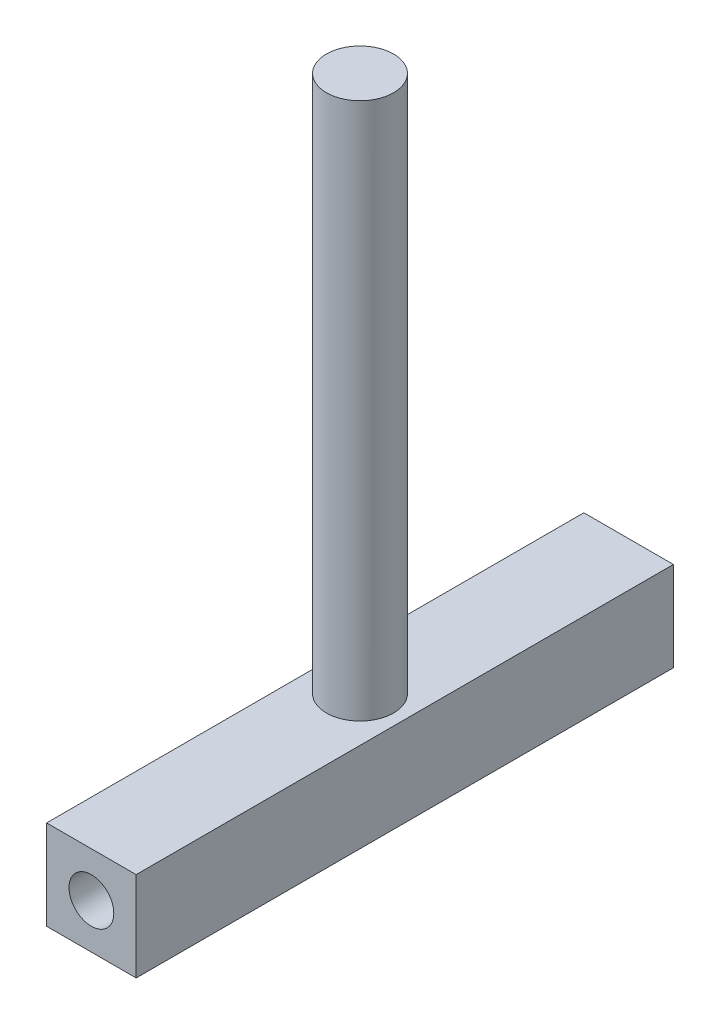
ISO-10303-21;
HEADER;
FILE_DESCRIPTION(('STEP AP214'),'2;1');
FILE_NAME('part.step','',(''),(''),'','','');
FILE_SCHEMA(('AUTOMOTIVE_DESIGN { 1 0 10303 214 1 1 1 1 }'));
ENDSEC;
DATA;
#1=APPLICATION_CONTEXT('core data for automotive mechanical design processes');
#2=APPLICATION_PROTOCOL_DEFINITION('international standard','automotive_design',2000,#1);
#3=PRODUCT_CONTEXT('',#1,'mechanical');
#4=PRODUCT('Part','Part','',(#3));
#5=PRODUCT_RELATED_PRODUCT_CATEGORY('part','',(#4));
#6=PRODUCT_DEFINITION_FORMATION('','',#4);
#7=PRODUCT_DEFINITION_CONTEXT('part definition',#1,'design');
#8=PRODUCT_DEFINITION('design','',#6,#7);
#9=PRODUCT_DEFINITION_SHAPE('','',#8);
#10=(LENGTH_UNIT() NAMED_UNIT(*) SI_UNIT(.MILLI.,.METRE.));
#11=(NAMED_UNIT(*) PLANE_ANGLE_UNIT() SI_UNIT($,.RADIAN.));
#12=(NAMED_UNIT(*) SI_UNIT($,.STERADIAN.) SOLID_ANGLE_UNIT());
#13=UNCERTAINTY_MEASURE_WITH_UNIT(LENGTH_MEASURE(1.E-05),#10,'distance_accuracy_value','');
#14=(GEOMETRIC_REPRESENTATION_CONTEXT(3) GLOBAL_UNCERTAINTY_ASSIGNED_CONTEXT((#13)) GLOBAL_UNIT_ASSIGNED_CONTEXT((#10,
#11,#12)) REPRESENTATION_CONTEXT('',''));
#15=CARTESIAN_POINT('',(0.,0.,0.));
#16=DIRECTION('',(0.,0.,1.));
#17=DIRECTION('',(1.,0.,0.));
#18=AXIS2_PLACEMENT_3D('',#15,#16,#17);
#19=CARTESIAN_POINT('',(0.,0.,120.));
#20=DIRECTION('',(0.,0.,1.));
#21=DIRECTION('',(1.,0.,0.));
#22=AXIS2_PLACEMENT_3D('',#19,#20,#21);
#23=PLANE('',#22);
#24=DIRECTION('',(0.,1.,0.));
#25=VECTOR('',#24,1.);
#26=CARTESIAN_POINT('',(10.,10.,120.));
#27=LINE('',#26,#25);
#28=CARTESIAN_POINT('',(10.,-10.,120.));
#29=VERTEX_POINT('',#28);
#30=CARTESIAN_POINT('',(10.,10.,120.));
#31=VERTEX_POINT('',#30);
#32=EDGE_CURVE('E93',#29,#31,#27,.T.);
#33=ORIENTED_EDGE('',*,*,#32,.T.);
#34=DIRECTION('',(-1.,0.,0.));
#35=VECTOR('',#34,1.);
#36=CARTESIAN_POINT('',(-10.,10.,120.));
#37=LINE('',#36,#35);
#38=CARTESIAN_POINT('',(-10.,10.,120.));
#39=VERTEX_POINT('',#38);
#40=EDGE_CURVE('E88',#31,#39,#37,.T.);
#41=ORIENTED_EDGE('',*,*,#40,.T.);
#42=DIRECTION('',(0.,-1.,0.));
#43=VECTOR('',#42,1.);
#44=CARTESIAN_POINT('',(-10.,10.,120.));
#45=LINE('',#44,#43);
#46=CARTESIAN_POINT('',(-10.,-10.,120.));
#47=VERTEX_POINT('',#46);
#48=EDGE_CURVE('E91',#39,#47,#45,.T.);
#49=ORIENTED_EDGE('',*,*,#48,.T.);
#50=DIRECTION('',(1.,0.,0.));
#51=VECTOR('',#50,1.);
#52=CARTESIAN_POINT('',(-10.,-10.,120.));
#53=LINE('',#52,#51);
#54=EDGE_CURVE('E57',#47,#29,#53,.T.);
#55=ORIENTED_EDGE('',*,*,#54,.T.);
#56=EDGE_LOOP('',(#33,#41,#49,#55));
#57=FACE_BOUND('',#56,.T.);
#58=CARTESIAN_POINT('',(0.,0.,120.));
#59=DIRECTION('',(0.,0.,1.));
#60=DIRECTION('',(1.,0.,0.));
#61=AXIS2_PLACEMENT_3D('',#58,#59,#60);
#62=CIRCLE('',#61,5.);
#63=CARTESIAN_POINT('',(5.,0.,120.));
#64=VERTEX_POINT('',#63);
#65=EDGE_CURVE('E115',#64,#64,#62,.T.);
#66=ORIENTED_EDGE('',*,*,#65,.F.);
#67=EDGE_LOOP('',(#66));
#68=FACE_BOUND('',#67,.T.);
#69=ADVANCED_FACE('F39',(#57,#68),#23,.T.);
#70=CARTESIAN_POINT('',(0.,0.,0.));
#71=DIRECTION('',(0.,0.,1.));
#72=DIRECTION('',(1.,0.,0.));
#73=AXIS2_PLACEMENT_3D('',#70,#71,#72);
#74=PLANE('',#73);
#75=DIRECTION('',(0.,1.,0.));
#76=VECTOR('',#75,1.);
#77=CARTESIAN_POINT('',(10.,10.,0.));
#78=LINE('',#77,#76);
#79=CARTESIAN_POINT('',(10.,-10.,0.));
#80=VERTEX_POINT('',#79);
#81=CARTESIAN_POINT('',(10.,10.,0.));
#82=VERTEX_POINT('',#81);
#83=EDGE_CURVE('E111',#80,#82,#78,.T.);
#84=ORIENTED_EDGE('',*,*,#83,.F.);
#85=DIRECTION('',(1.,0.,0.));
#86=VECTOR('',#85,1.);
#87=CARTESIAN_POINT('',(-10.,-10.,0.));
#88=LINE('',#87,#86);
#89=CARTESIAN_POINT('',(-10.,-10.,0.));
#90=VERTEX_POINT('',#89);
#91=EDGE_CURVE('E80',#90,#80,#88,.T.);
#92=ORIENTED_EDGE('',*,*,#91,.F.);
#93=DIRECTION('',(0.,-1.,0.));
#94=VECTOR('',#93,1.);
#95=CARTESIAN_POINT('',(-10.,10.,0.));
#96=LINE('',#95,#94);
#97=CARTESIAN_POINT('',(-10.,10.,0.));
#98=VERTEX_POINT('',#97);
#99=EDGE_CURVE('E74',#98,#90,#96,.T.);
#100=ORIENTED_EDGE('',*,*,#99,.F.);
#101=DIRECTION('',(-1.,0.,0.));
#102=VECTOR('',#101,1.);
#103=CARTESIAN_POINT('',(-10.,10.,0.));
#104=LINE('',#103,#102);
#105=EDGE_CURVE('E99',#82,#98,#104,.T.);
#106=ORIENTED_EDGE('',*,*,#105,.F.);
#107=EDGE_LOOP('',(#84,#92,#100,#106));
#108=FACE_BOUND('',#107,.T.);
#109=CARTESIAN_POINT('',(0.,0.,0.));
#110=DIRECTION('',(0.,0.,1.));
#111=DIRECTION('',(1.,0.,0.));
#112=AXIS2_PLACEMENT_3D('',#109,#110,#111);
#113=CIRCLE('',#112,5.);
#114=CARTESIAN_POINT('',(5.,0.,0.));
#115=VERTEX_POINT('',#114);
#116=EDGE_CURVE('E135',#115,#115,#113,.T.);
#117=ORIENTED_EDGE('',*,*,#116,.T.);
#118=EDGE_LOOP('',(#117));
#119=FACE_BOUND('',#118,.T.);
#120=ADVANCED_FACE('F129',(#108,#119),#74,.F.);
#121=CARTESIAN_POINT('',(10.,10.,120.));
#122=DIRECTION('',(-1.,0.,0.));
#123=DIRECTION('',(0.,-1.,0.));
#124=AXIS2_PLACEMENT_3D('',#121,#122,#123);
#125=PLANE('',#124);
#126=ORIENTED_EDGE('',*,*,#83,.T.);
#127=DIRECTION('',(0.,0.,-1.));
#128=VECTOR('',#127,1.);
#129=CARTESIAN_POINT('',(10.,10.,120.));
#130=LINE('',#129,#128);
#131=EDGE_CURVE('E49',#31,#82,#130,.T.);
#132=ORIENTED_EDGE('',*,*,#131,.F.);
#133=ORIENTED_EDGE('',*,*,#32,.F.);
#134=DIRECTION('',(0.,0.,-1.));
#135=VECTOR('',#134,1.);
#136=CARTESIAN_POINT('',(10.,-10.,120.));
#137=LINE('',#136,#135);
#138=EDGE_CURVE('E107',#29,#80,#137,.T.);
#139=ORIENTED_EDGE('',*,*,#138,.T.);
#140=EDGE_LOOP('',(#126,#132,#133,#139));
#141=FACE_BOUND('',#140,.T.);
#142=ADVANCED_FACE('F41',(#141),#125,.F.);
#143=CARTESIAN_POINT('',(-10.,10.,120.));
#144=DIRECTION('',(0.,-1.,0.));
#145=DIRECTION('',(0.,0.,-1.));
#146=AXIS2_PLACEMENT_3D('',#143,#144,#145);
#147=PLANE('',#146);
#148=CARTESIAN_POINT('',(0.,9.99999999999999,60.));
#149=DIRECTION('',(0.,-1.,0.));
#150=DIRECTION('',(0.,0.,-1.));
#151=AXIS2_PLACEMENT_3D('',#148,#149,#150);
#152=CIRCLE('',#151,7.5);
#153=CARTESIAN_POINT('',(0.,9.99999999999999,52.5));
#154=VERTEX_POINT('',#153);
#155=EDGE_CURVE('E11',#154,#154,#152,.F.);
#156=ORIENTED_EDGE('',*,*,#155,.F.);
#157=EDGE_LOOP('',(#156));
#158=FACE_BOUND('',#157,.T.);
#159=ORIENTED_EDGE('',*,*,#105,.T.);
#160=DIRECTION('',(0.,0.,-1.));
#161=VECTOR('',#160,1.);
#162=CARTESIAN_POINT('',(-10.,10.,120.));
#163=LINE('',#162,#161);
#164=EDGE_CURVE('E97',#39,#98,#163,.T.);
#165=ORIENTED_EDGE('',*,*,#164,.F.);
#166=ORIENTED_EDGE('',*,*,#40,.F.);
#167=ORIENTED_EDGE('',*,*,#131,.T.);
#168=EDGE_LOOP('',(#159,#165,#166,#167));
#169=FACE_BOUND('',#168,.T.);
#170=ADVANCED_FACE('F98',(#158,#169),#147,.F.);
#171=CARTESIAN_POINT('',(-10.,10.,120.));
#172=DIRECTION('',(1.,0.,0.));
#173=DIRECTION('',(0.,1.,0.));
#174=AXIS2_PLACEMENT_3D('',#171,#172,#173);
#175=PLANE('',#174);
#176=ORIENTED_EDGE('',*,*,#99,.T.);
#177=DIRECTION('',(0.,0.,-1.));
#178=VECTOR('',#177,1.);
#179=CARTESIAN_POINT('',(-10.,-10.,120.));
#180=LINE('',#179,#178);
#181=EDGE_CURVE('E101',#47,#90,#180,.T.);
#182=ORIENTED_EDGE('',*,*,#181,.F.);
#183=ORIENTED_EDGE('',*,*,#48,.F.);
#184=ORIENTED_EDGE('',*,*,#164,.T.);
#185=EDGE_LOOP('',(#176,#182,#183,#184));
#186=FACE_BOUND('',#185,.T.);
#187=ADVANCED_FACE('F103',(#186),#175,.F.);
#188=CARTESIAN_POINT('',(-10.,-10.,120.));
#189=DIRECTION('',(0.,1.,0.));
#190=DIRECTION('',(0.,0.,1.));
#191=AXIS2_PLACEMENT_3D('',#188,#189,#190);
#192=PLANE('',#191);
#193=ORIENTED_EDGE('',*,*,#91,.T.);
#194=ORIENTED_EDGE('',*,*,#138,.F.);
#195=ORIENTED_EDGE('',*,*,#54,.F.);
#196=ORIENTED_EDGE('',*,*,#181,.T.);
#197=EDGE_LOOP('',(#193,#194,#195,#196));
#198=FACE_BOUND('',#197,.T.);
#199=ADVANCED_FACE('F163',(#198),#192,.F.);
#200=CARTESIAN_POINT('',(0.,0.,120.));
#201=DIRECTION('',(0.,0.,-1.));
#202=DIRECTION('',(-1.,0.,0.));
#203=AXIS2_PLACEMENT_3D('',#200,#201,#202);
#204=CYLINDRICAL_SURFACE('',#203,5.);
#205=ORIENTED_EDGE('',*,*,#65,.T.);
#206=EDGE_LOOP('',(#205));
#207=FACE_BOUND('',#206,.T.);
#208=ORIENTED_EDGE('',*,*,#116,.F.);
#209=EDGE_LOOP('',(#208));
#210=FACE_BOUND('',#209,.T.);
#211=ADVANCED_FACE('F154',(#207,#210),#204,.F.);
#212=CARTESIAN_POINT('',(0.,130.,60.));
#213=DIRECTION('',(0.,-1.,0.));
#214=DIRECTION('',(0.,0.,-1.));
#215=AXIS2_PLACEMENT_3D('',#212,#213,#214);
#216=CYLINDRICAL_SURFACE('',#215,7.5);
#217=CARTESIAN_POINT('',(0.,130.,60.));
#218=DIRECTION('',(0.,1.,0.));
#219=DIRECTION('',(0.,0.,1.));
#220=AXIS2_PLACEMENT_3D('',#217,#218,#219);
#221=CIRCLE('',#220,7.5);
#222=CARTESIAN_POINT('',(0.,130.,67.5));
#223=VERTEX_POINT('',#222);
#224=EDGE_CURVE('E138',#223,#223,#221,.T.);
#225=ORIENTED_EDGE('',*,*,#224,.F.);
#226=EDGE_LOOP('',(#225));
#227=FACE_BOUND('',#226,.T.);
#228=ORIENTED_EDGE('',*,*,#155,.T.);
#229=EDGE_LOOP('',(#228));
#230=FACE_BOUND('',#229,.T.);
#231=ADVANCED_FACE('F151',(#227,#230),#216,.T.);
#232=CARTESIAN_POINT('',(0.,130.,60.));
#233=DIRECTION('',(0.,1.,0.));
#234=DIRECTION('',(0.,0.,1.));
#235=AXIS2_PLACEMENT_3D('',#232,#233,#234);
#236=PLANE('',#235);
#237=ORIENTED_EDGE('',*,*,#224,.T.);
#238=EDGE_LOOP('',(#237));
#239=FACE_BOUND('',#238,.T.);
#240=ADVANCED_FACE('F149',(#239),#236,.T.);
#241=CLOSED_SHELL('',(#69,#120,#142,#170,#187,#199,#211,#231,#240));
#242=MANIFOLD_SOLID_BREP('B2',#241);
#243=ADVANCED_BREP_SHAPE_REPRESENTATION('',(#18,#242),#14);
#244=SHAPE_DEFINITION_REPRESENTATION(#9,#243);
ENDSEC;
END-ISO-10303-21;
